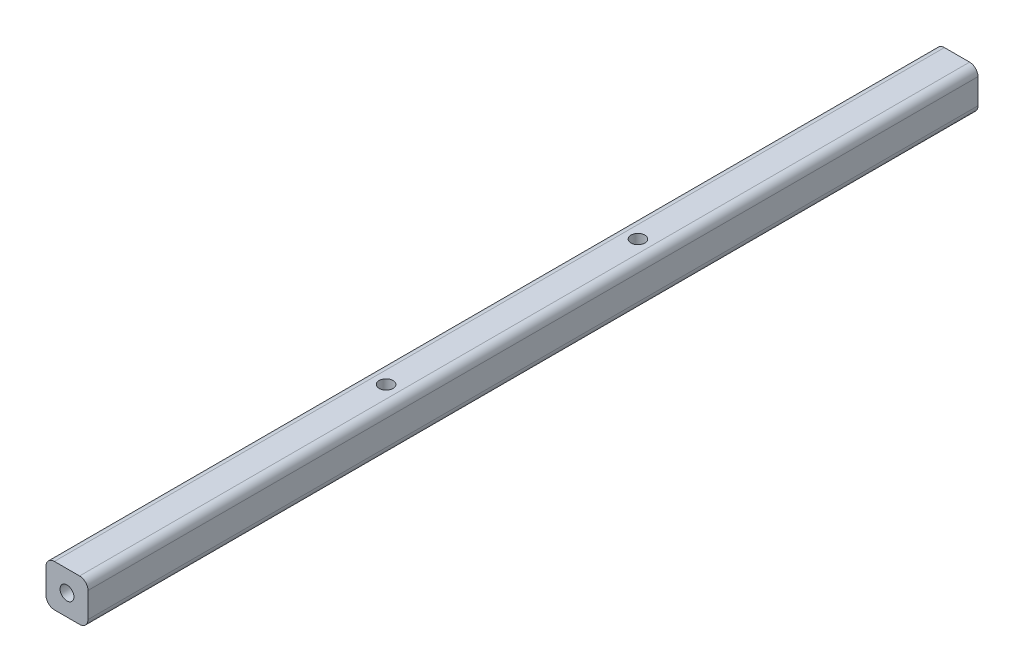
ISO-10303-21;
HEADER;
FILE_DESCRIPTION(('STEP AP214'),'2;1');
FILE_NAME('part.step','',(''),(''),'','','');
FILE_SCHEMA(('AUTOMOTIVE_DESIGN { 1 0 10303 214 1 1 1 1 }'));
ENDSEC;
DATA;
#1=APPLICATION_CONTEXT('core data for automotive mechanical design processes');
#2=APPLICATION_PROTOCOL_DEFINITION('international standard','automotive_design',2000,#1);
#3=PRODUCT_CONTEXT('',#1,'mechanical');
#4=PRODUCT('Part','Part','',(#3));
#5=PRODUCT_RELATED_PRODUCT_CATEGORY('part','',(#4));
#6=PRODUCT_DEFINITION_FORMATION('','',#4);
#7=PRODUCT_DEFINITION_CONTEXT('part definition',#1,'design');
#8=PRODUCT_DEFINITION('design','',#6,#7);
#9=PRODUCT_DEFINITION_SHAPE('','',#8);
#10=(LENGTH_UNIT() NAMED_UNIT(*) SI_UNIT(.MILLI.,.METRE.));
#11=(NAMED_UNIT(*) PLANE_ANGLE_UNIT() SI_UNIT($,.RADIAN.));
#12=(NAMED_UNIT(*) SI_UNIT($,.STERADIAN.) SOLID_ANGLE_UNIT());
#13=UNCERTAINTY_MEASURE_WITH_UNIT(LENGTH_MEASURE(1.E-05),#10,'distance_accuracy_value','');
#14=(GEOMETRIC_REPRESENTATION_CONTEXT(3) GLOBAL_UNCERTAINTY_ASSIGNED_CONTEXT((#13)) GLOBAL_UNIT_ASSIGNED_CONTEXT((#10,
#11,#12)) REPRESENTATION_CONTEXT('',''));
#15=CARTESIAN_POINT('',(0.,0.,0.));
#16=DIRECTION('',(0.,0.,1.));
#17=DIRECTION('',(1.,0.,0.));
#18=AXIS2_PLACEMENT_3D('',#15,#16,#17);
#19=CARTESIAN_POINT('',(-5.,5.,106.));
#20=DIRECTION('',(0.,-1.,0.));
#21=DIRECTION('',(0.,0.,-1.));
#22=AXIS2_PLACEMENT_3D('',#19,#20,#21);
#23=PLANE('',#22);
#24=CARTESIAN_POINT('',(0.,5.,30.));
#25=DIRECTION('',(0.,1.,0.));
#26=DIRECTION('',(0.,0.,1.));
#27=AXIS2_PLACEMENT_3D('',#24,#25,#26);
#28=CIRCLE('',#27,1.64999999999999);
#29=CARTESIAN_POINT('',(0.,5.,31.65));
#30=VERTEX_POINT('',#29);
#31=EDGE_CURVE('E250',#30,#30,#28,.T.);
#32=ORIENTED_EDGE('',*,*,#31,.F.);
#33=EDGE_LOOP('',(#32));
#34=FACE_BOUND('',#33,.T.);
#35=DIRECTION('',(-1.,0.,0.));
#36=VECTOR('',#35,1.);
#37=CARTESIAN_POINT('',(-5.,5.,106.));
#38=LINE('',#37,#36);
#39=CARTESIAN_POINT('',(3.,5.,106.));
#40=VERTEX_POINT('',#39);
#41=CARTESIAN_POINT('',(-3.,5.,106.));
#42=VERTEX_POINT('',#41);
#43=EDGE_CURVE('E139',#40,#42,#38,.T.);
#44=ORIENTED_EDGE('',*,*,#43,.F.);
#45=DIRECTION('',(0.,0.,-1.));
#46=VECTOR('',#45,1.);
#47=CARTESIAN_POINT('',(3.,5.,106.));
#48=LINE('',#47,#46);
#49=CARTESIAN_POINT('',(3.,5.,-106.));
#50=VERTEX_POINT('',#49);
#51=EDGE_CURVE('E153',#40,#50,#48,.T.);
#52=ORIENTED_EDGE('',*,*,#51,.T.);
#53=DIRECTION('',(-1.,0.,0.));
#54=VECTOR('',#53,1.);
#55=CARTESIAN_POINT('',(-5.,5.,-106.));
#56=LINE('',#55,#54);
#57=CARTESIAN_POINT('',(-3.,5.,-106.));
#58=VERTEX_POINT('',#57);
#59=EDGE_CURVE('E134',#50,#58,#56,.T.);
#60=ORIENTED_EDGE('',*,*,#59,.T.);
#61=DIRECTION('',(0.,0.,-1.));
#62=VECTOR('',#61,1.);
#63=CARTESIAN_POINT('',(-3.,5.,106.));
#64=LINE('',#63,#62);
#65=EDGE_CURVE('E142',#58,#42,#64,.F.);
#66=ORIENTED_EDGE('',*,*,#65,.T.);
#67=EDGE_LOOP('',(#44,#52,#60,#66));
#68=FACE_BOUND('',#67,.T.);
#69=CARTESIAN_POINT('',(0.,5.,-30.));
#70=DIRECTION('',(0.,1.,0.));
#71=DIRECTION('',(0.,0.,1.));
#72=AXIS2_PLACEMENT_3D('',#69,#70,#71);
#73=CIRCLE('',#72,1.64999999999999);
#74=CARTESIAN_POINT('',(0.,5.,-28.35));
#75=VERTEX_POINT('',#74);
#76=EDGE_CURVE('E245',#75,#75,#73,.T.);
#77=ORIENTED_EDGE('',*,*,#76,.F.);
#78=EDGE_LOOP('',(#77));
#79=FACE_BOUND('',#78,.T.);
#80=ADVANCED_FACE('F37',(#34,#68,#79),#23,.F.);
#81=CARTESIAN_POINT('',(-5.,5.,106.));
#82=DIRECTION('',(1.,0.,0.));
#83=DIRECTION('',(0.,1.,0.));
#84=AXIS2_PLACEMENT_3D('',#81,#82,#83);
#85=PLANE('',#84);
#86=DIRECTION('',(0.,-1.,0.));
#87=VECTOR('',#86,1.);
#88=CARTESIAN_POINT('',(-5.,5.,106.));
#89=LINE('',#88,#87);
#90=CARTESIAN_POINT('',(-5.,3.,106.));
#91=VERTEX_POINT('',#90);
#92=CARTESIAN_POINT('',(-5.,-3.,106.));
#93=VERTEX_POINT('',#92);
#94=EDGE_CURVE('E131',#91,#93,#89,.T.);
#95=ORIENTED_EDGE('',*,*,#94,.F.);
#96=DIRECTION('',(0.,0.,-1.));
#97=VECTOR('',#96,1.);
#98=CARTESIAN_POINT('',(-5.,3.,106.));
#99=LINE('',#98,#97);
#100=CARTESIAN_POINT('',(-5.,3.,-106.));
#101=VERTEX_POINT('',#100);
#102=EDGE_CURVE('E178',#91,#101,#99,.T.);
#103=ORIENTED_EDGE('',*,*,#102,.T.);
#104=DIRECTION('',(0.,-1.,0.));
#105=VECTOR('',#104,1.);
#106=CARTESIAN_POINT('',(-5.,5.,-106.));
#107=LINE('',#106,#105);
#108=CARTESIAN_POINT('',(-5.,-3.,-106.));
#109=VERTEX_POINT('',#108);
#110=EDGE_CURVE('E130',#101,#109,#107,.T.);
#111=ORIENTED_EDGE('',*,*,#110,.T.);
#112=DIRECTION('',(0.,0.,-1.));
#113=VECTOR('',#112,1.);
#114=CARTESIAN_POINT('',(-5.,-3.,106.));
#115=LINE('',#114,#113);
#116=EDGE_CURVE('E176',#109,#93,#115,.F.);
#117=ORIENTED_EDGE('',*,*,#116,.T.);
#118=EDGE_LOOP('',(#95,#103,#111,#117));
#119=FACE_BOUND('',#118,.T.);
#120=ADVANCED_FACE('F184',(#119),#85,.F.);
#121=CARTESIAN_POINT('',(-5.,-5.,106.));
#122=DIRECTION('',(0.,1.,0.));
#123=DIRECTION('',(0.,0.,1.));
#124=AXIS2_PLACEMENT_3D('',#121,#122,#123);
#125=PLANE('',#124);
#126=CARTESIAN_POINT('',(0.,-5.,30.));
#127=DIRECTION('',(0.,1.,0.));
#128=DIRECTION('',(0.,0.,1.));
#129=AXIS2_PLACEMENT_3D('',#126,#127,#128);
#130=CIRCLE('',#129,1.64999999999999);
#131=CARTESIAN_POINT('',(0.,-5.,31.65));
#132=VERTEX_POINT('',#131);
#133=EDGE_CURVE('E241',#132,#132,#130,.T.);
#134=ORIENTED_EDGE('',*,*,#133,.T.);
#135=EDGE_LOOP('',(#134));
#136=FACE_BOUND('',#135,.T.);
#137=CARTESIAN_POINT('',(0.,-5.,-30.));
#138=DIRECTION('',(0.,1.,0.));
#139=DIRECTION('',(0.,0.,1.));
#140=AXIS2_PLACEMENT_3D('',#137,#138,#139);
#141=CIRCLE('',#140,1.64999999999999);
#142=CARTESIAN_POINT('',(0.,-5.,-28.35));
#143=VERTEX_POINT('',#142);
#144=EDGE_CURVE('E124',#143,#143,#141,.T.);
#145=ORIENTED_EDGE('',*,*,#144,.T.);
#146=EDGE_LOOP('',(#145));
#147=FACE_BOUND('',#146,.T.);
#148=DIRECTION('',(1.,0.,0.));
#149=VECTOR('',#148,1.);
#150=CARTESIAN_POINT('',(-5.,-5.,106.));
#151=LINE('',#150,#149);
#152=CARTESIAN_POINT('',(-3.,-5.,106.));
#153=VERTEX_POINT('',#152);
#154=CARTESIAN_POINT('',(3.,-5.,106.));
#155=VERTEX_POINT('',#154);
#156=EDGE_CURVE('E133',#153,#155,#151,.T.);
#157=ORIENTED_EDGE('',*,*,#156,.F.);
#158=DIRECTION('',(0.,0.,-1.));
#159=VECTOR('',#158,1.);
#160=CARTESIAN_POINT('',(-3.,-5.,106.));
#161=LINE('',#160,#159);
#162=CARTESIAN_POINT('',(-3.,-5.,-106.));
#163=VERTEX_POINT('',#162);
#164=EDGE_CURVE('E11',#153,#163,#161,.T.);
#165=ORIENTED_EDGE('',*,*,#164,.T.);
#166=DIRECTION('',(1.,0.,0.));
#167=VECTOR('',#166,1.);
#168=CARTESIAN_POINT('',(-5.,-5.,-106.));
#169=LINE('',#168,#167);
#170=CARTESIAN_POINT('',(3.,-5.,-106.));
#171=VERTEX_POINT('',#170);
#172=EDGE_CURVE('E145',#163,#171,#169,.T.);
#173=ORIENTED_EDGE('',*,*,#172,.T.);
#174=DIRECTION('',(0.,0.,-1.));
#175=VECTOR('',#174,1.);
#176=CARTESIAN_POINT('',(3.,-5.,106.));
#177=LINE('',#176,#175);
#178=EDGE_CURVE('E45',#171,#155,#177,.F.);
#179=ORIENTED_EDGE('',*,*,#178,.T.);
#180=EDGE_LOOP('',(#157,#165,#173,#179));
#181=FACE_BOUND('',#180,.T.);
#182=ADVANCED_FACE('F195',(#136,#147,#181),#125,.F.);
#183=CARTESIAN_POINT('',(5.,5.,106.));
#184=DIRECTION('',(-1.,0.,0.));
#185=DIRECTION('',(0.,-1.,0.));
#186=AXIS2_PLACEMENT_3D('',#183,#184,#185);
#187=PLANE('',#186);
#188=DIRECTION('',(0.,1.,0.));
#189=VECTOR('',#188,1.);
#190=CARTESIAN_POINT('',(5.,5.,-106.));
#191=LINE('',#190,#189);
#192=CARTESIAN_POINT('',(5.,-3.,-106.));
#193=VERTEX_POINT('',#192);
#194=CARTESIAN_POINT('',(5.,3.,-106.));
#195=VERTEX_POINT('',#194);
#196=EDGE_CURVE('E147',#193,#195,#191,.T.);
#197=ORIENTED_EDGE('',*,*,#196,.T.);
#198=DIRECTION('',(0.,0.,-1.));
#199=VECTOR('',#198,1.);
#200=CARTESIAN_POINT('',(5.,3.,106.));
#201=LINE('',#200,#199);
#202=CARTESIAN_POINT('',(5.,3.,106.));
#203=VERTEX_POINT('',#202);
#204=EDGE_CURVE('E167',#195,#203,#201,.F.);
#205=ORIENTED_EDGE('',*,*,#204,.T.);
#206=DIRECTION('',(0.,1.,0.));
#207=VECTOR('',#206,1.);
#208=CARTESIAN_POINT('',(5.,5.,106.));
#209=LINE('',#208,#207);
#210=CARTESIAN_POINT('',(5.,-3.,106.));
#211=VERTEX_POINT('',#210);
#212=EDGE_CURVE('E136',#211,#203,#209,.T.);
#213=ORIENTED_EDGE('',*,*,#212,.F.);
#214=DIRECTION('',(0.,0.,-1.));
#215=VECTOR('',#214,1.);
#216=CARTESIAN_POINT('',(5.,-3.,106.));
#217=LINE('',#216,#215);
#218=EDGE_CURVE('E164',#211,#193,#217,.T.);
#219=ORIENTED_EDGE('',*,*,#218,.T.);
#220=EDGE_LOOP('',(#197,#205,#213,#219));
#221=FACE_BOUND('',#220,.T.);
#222=ADVANCED_FACE('F203',(#221),#187,.F.);
#223=CARTESIAN_POINT('',(0.,0.,106.));
#224=DIRECTION('',(0.,0.,1.));
#225=DIRECTION('',(1.,0.,0.));
#226=AXIS2_PLACEMENT_3D('',#223,#224,#225);
#227=PLANE('',#226);
#228=CARTESIAN_POINT('',(0.,0.,106.));
#229=DIRECTION('',(0.,0.,1.));
#230=DIRECTION('',(1.,0.,0.));
#231=AXIS2_PLACEMENT_3D('',#228,#229,#230);
#232=CIRCLE('',#231,1.64999999999999);
#233=CARTESIAN_POINT('',(1.64999999999999,0.,106.));
#234=VERTEX_POINT('',#233);
#235=EDGE_CURVE('E117',#234,#234,#232,.T.);
#236=ORIENTED_EDGE('',*,*,#235,.F.);
#237=EDGE_LOOP('',(#236));
#238=FACE_BOUND('',#237,.T.);
#239=ORIENTED_EDGE('',*,*,#212,.T.);
#240=CARTESIAN_POINT('',(3.,3.,106.));
#241=DIRECTION('',(0.,0.,1.));
#242=DIRECTION('',(1.,0.,0.));
#243=AXIS2_PLACEMENT_3D('',#240,#241,#242);
#244=CIRCLE('',#243,2.);
#245=EDGE_CURVE('E174',#203,#40,#244,.T.);
#246=ORIENTED_EDGE('',*,*,#245,.T.);
#247=ORIENTED_EDGE('',*,*,#43,.T.);
#248=CARTESIAN_POINT('',(-3.,3.,106.));
#249=DIRECTION('',(0.,0.,1.));
#250=DIRECTION('',(1.,0.,0.));
#251=AXIS2_PLACEMENT_3D('',#248,#249,#250);
#252=CIRCLE('',#251,2.);
#253=EDGE_CURVE('E172',#42,#91,#252,.T.);
#254=ORIENTED_EDGE('',*,*,#253,.T.);
#255=ORIENTED_EDGE('',*,*,#94,.T.);
#256=CARTESIAN_POINT('',(-3.,-3.,106.));
#257=DIRECTION('',(0.,0.,1.));
#258=DIRECTION('',(1.,0.,0.));
#259=AXIS2_PLACEMENT_3D('',#256,#257,#258);
#260=CIRCLE('',#259,2.);
#261=EDGE_CURVE('E58',#93,#153,#260,.T.);
#262=ORIENTED_EDGE('',*,*,#261,.T.);
#263=ORIENTED_EDGE('',*,*,#156,.T.);
#264=CARTESIAN_POINT('',(3.,-3.,106.));
#265=DIRECTION('',(0.,0.,1.));
#266=DIRECTION('',(1.,0.,0.));
#267=AXIS2_PLACEMENT_3D('',#264,#265,#266);
#268=CIRCLE('',#267,2.);
#269=EDGE_CURVE('E169',#155,#211,#268,.T.);
#270=ORIENTED_EDGE('',*,*,#269,.T.);
#271=EDGE_LOOP('',(#239,#246,#247,#254,#255,#262,#263,#270));
#272=FACE_BOUND('',#271,.T.);
#273=ADVANCED_FACE('F197',(#238,#272),#227,.T.);
#274=CARTESIAN_POINT('',(0.,0.,-106.));
#275=DIRECTION('',(0.,0.,1.));
#276=DIRECTION('',(1.,0.,0.));
#277=AXIS2_PLACEMENT_3D('',#274,#275,#276);
#278=PLANE('',#277);
#279=CARTESIAN_POINT('',(0.,0.,-106.));
#280=DIRECTION('',(0.,0.,-1.));
#281=DIRECTION('',(-1.,0.,0.));
#282=AXIS2_PLACEMENT_3D('',#279,#280,#281);
#283=CIRCLE('',#282,1.64999999999999);
#284=CARTESIAN_POINT('',(-1.64999999999999,0.,-106.));
#285=VERTEX_POINT('',#284);
#286=EDGE_CURVE('E118',#285,#285,#283,.T.);
#287=ORIENTED_EDGE('',*,*,#286,.F.);
#288=EDGE_LOOP('',(#287));
#289=FACE_BOUND('',#288,.T.);
#290=ORIENTED_EDGE('',*,*,#59,.F.);
#291=CARTESIAN_POINT('',(3.,3.,-106.));
#292=DIRECTION('',(0.,0.,1.));
#293=DIRECTION('',(1.,0.,0.));
#294=AXIS2_PLACEMENT_3D('',#291,#292,#293);
#295=CIRCLE('',#294,2.);
#296=EDGE_CURVE('E162',#50,#195,#295,.F.);
#297=ORIENTED_EDGE('',*,*,#296,.T.);
#298=ORIENTED_EDGE('',*,*,#196,.F.);
#299=CARTESIAN_POINT('',(3.,-3.,-106.));
#300=DIRECTION('',(0.,0.,1.));
#301=DIRECTION('',(1.,0.,0.));
#302=AXIS2_PLACEMENT_3D('',#299,#300,#301);
#303=CIRCLE('',#302,2.);
#304=EDGE_CURVE('E156',#193,#171,#303,.F.);
#305=ORIENTED_EDGE('',*,*,#304,.T.);
#306=ORIENTED_EDGE('',*,*,#172,.F.);
#307=CARTESIAN_POINT('',(-3.,-3.,-106.));
#308=DIRECTION('',(0.,0.,1.));
#309=DIRECTION('',(1.,0.,0.));
#310=AXIS2_PLACEMENT_3D('',#307,#308,#309);
#311=CIRCLE('',#310,2.);
#312=EDGE_CURVE('E158',#163,#109,#311,.F.);
#313=ORIENTED_EDGE('',*,*,#312,.T.);
#314=ORIENTED_EDGE('',*,*,#110,.F.);
#315=CARTESIAN_POINT('',(-3.,3.,-106.));
#316=DIRECTION('',(0.,0.,1.));
#317=DIRECTION('',(1.,0.,0.));
#318=AXIS2_PLACEMENT_3D('',#315,#316,#317);
#319=CIRCLE('',#318,2.);
#320=EDGE_CURVE('E160',#101,#58,#319,.F.);
#321=ORIENTED_EDGE('',*,*,#320,.T.);
#322=EDGE_LOOP('',(#290,#297,#298,#305,#306,#313,#314,#321));
#323=FACE_BOUND('',#322,.T.);
#324=ADVANCED_FACE('F190',(#289,#323),#278,.F.);
#325=CARTESIAN_POINT('',(0.,0.,94.5));
#326=DIRECTION('',(0.,0.,1.));
#327=DIRECTION('',(1.,0.,0.));
#328=AXIS2_PLACEMENT_3D('',#325,#326,#327);
#329=CONICAL_SURFACE('',#328,1.65,1.02974425867665);
#330=CARTESIAN_POINT('',(0.,0.,93.5085799786045));
#331=VERTEX_POINT('',#330);
#332=VERTEX_LOOP('',#331);
#333=FACE_BOUND('',#332,.T.);
#334=CARTESIAN_POINT('',(0.,0.,94.5));
#335=DIRECTION('',(0.,0.,1.));
#336=DIRECTION('',(1.,0.,0.));
#337=AXIS2_PLACEMENT_3D('',#334,#335,#336);
#338=CIRCLE('',#337,1.65);
#339=CARTESIAN_POINT('',(1.65,0.,94.5));
#340=VERTEX_POINT('',#339);
#341=EDGE_CURVE('E121',#340,#340,#338,.T.);
#342=ORIENTED_EDGE('',*,*,#341,.T.);
#343=EDGE_LOOP('',(#342));
#344=FACE_BOUND('',#343,.T.);
#345=ADVANCED_FACE('F267',(#333,#344),#329,.F.);
#346=CARTESIAN_POINT('',(0.,0.,106.));
#347=DIRECTION('',(0.,0.,1.));
#348=DIRECTION('',(1.,0.,0.));
#349=AXIS2_PLACEMENT_3D('',#346,#347,#348);
#350=CYLINDRICAL_SURFACE('',#349,1.64999999999999);
#351=ORIENTED_EDGE('',*,*,#341,.F.);
#352=EDGE_LOOP('',(#351));
#353=FACE_BOUND('',#352,.T.);
#354=ORIENTED_EDGE('',*,*,#235,.T.);
#355=EDGE_LOOP('',(#354));
#356=FACE_BOUND('',#355,.T.);
#357=ADVANCED_FACE('F111',(#353,#356),#350,.F.);
#358=CARTESIAN_POINT('',(0.,0.,-94.5));
#359=DIRECTION('',(0.,0.,-1.));
#360=DIRECTION('',(-1.,0.,0.));
#361=AXIS2_PLACEMENT_3D('',#358,#359,#360);
#362=CONICAL_SURFACE('',#361,1.65,1.02974425867665);
#363=CARTESIAN_POINT('',(0.,0.,-93.5085799786045));
#364=VERTEX_POINT('',#363);
#365=VERTEX_LOOP('',#364);
#366=FACE_BOUND('',#365,.T.);
#367=CARTESIAN_POINT('',(0.,0.,-94.5));
#368=DIRECTION('',(0.,0.,-1.));
#369=DIRECTION('',(-1.,0.,0.));
#370=AXIS2_PLACEMENT_3D('',#367,#368,#369);
#371=CIRCLE('',#370,1.65);
#372=CARTESIAN_POINT('',(-1.65,0.,-94.5));
#373=VERTEX_POINT('',#372);
#374=EDGE_CURVE('E115',#373,#373,#371,.T.);
#375=ORIENTED_EDGE('',*,*,#374,.T.);
#376=EDGE_LOOP('',(#375));
#377=FACE_BOUND('',#376,.T.);
#378=ADVANCED_FACE('F107',(#366,#377),#362,.F.);
#379=CARTESIAN_POINT('',(0.,0.,-106.));
#380=DIRECTION('',(0.,0.,-1.));
#381=DIRECTION('',(-1.,0.,0.));
#382=AXIS2_PLACEMENT_3D('',#379,#380,#381);
#383=CYLINDRICAL_SURFACE('',#382,1.64999999999999);
#384=ORIENTED_EDGE('',*,*,#374,.F.);
#385=EDGE_LOOP('',(#384));
#386=FACE_BOUND('',#385,.T.);
#387=ORIENTED_EDGE('',*,*,#286,.T.);
#388=EDGE_LOOP('',(#387));
#389=FACE_BOUND('',#388,.T.);
#390=ADVANCED_FACE('F110',(#386,#389),#383,.F.);
#391=CARTESIAN_POINT('',(3.,3.,106.));
#392=DIRECTION('',(0.,0.,-1.));
#393=DIRECTION('',(-1.,0.,0.));
#394=AXIS2_PLACEMENT_3D('',#391,#392,#393);
#395=CYLINDRICAL_SURFACE('',#394,2.);
#396=ORIENTED_EDGE('',*,*,#245,.F.);
#397=ORIENTED_EDGE('',*,*,#204,.F.);
#398=ORIENTED_EDGE('',*,*,#296,.F.);
#399=ORIENTED_EDGE('',*,*,#51,.F.);
#400=EDGE_LOOP('',(#396,#397,#398,#399));
#401=FACE_BOUND('',#400,.T.);
#402=ADVANCED_FACE('F208',(#401),#395,.T.);
#403=CARTESIAN_POINT('',(-3.,3.,106.));
#404=DIRECTION('',(0.,0.,-1.));
#405=DIRECTION('',(-1.,0.,0.));
#406=AXIS2_PLACEMENT_3D('',#403,#404,#405);
#407=CYLINDRICAL_SURFACE('',#406,2.);
#408=ORIENTED_EDGE('',*,*,#253,.F.);
#409=ORIENTED_EDGE('',*,*,#65,.F.);
#410=ORIENTED_EDGE('',*,*,#320,.F.);
#411=ORIENTED_EDGE('',*,*,#102,.F.);
#412=EDGE_LOOP('',(#408,#409,#410,#411));
#413=FACE_BOUND('',#412,.T.);
#414=ADVANCED_FACE('F213',(#413),#407,.T.);
#415=CARTESIAN_POINT('',(-3.,-3.,106.));
#416=DIRECTION('',(0.,0.,-1.));
#417=DIRECTION('',(-1.,0.,0.));
#418=AXIS2_PLACEMENT_3D('',#415,#416,#417);
#419=CYLINDRICAL_SURFACE('',#418,2.);
#420=ORIENTED_EDGE('',*,*,#261,.F.);
#421=ORIENTED_EDGE('',*,*,#116,.F.);
#422=ORIENTED_EDGE('',*,*,#312,.F.);
#423=ORIENTED_EDGE('',*,*,#164,.F.);
#424=EDGE_LOOP('',(#420,#421,#422,#423));
#425=FACE_BOUND('',#424,.T.);
#426=ADVANCED_FACE('F194',(#425),#419,.T.);
#427=CARTESIAN_POINT('',(3.,-3.,106.));
#428=DIRECTION('',(0.,0.,-1.));
#429=DIRECTION('',(-1.,0.,0.));
#430=AXIS2_PLACEMENT_3D('',#427,#428,#429);
#431=CYLINDRICAL_SURFACE('',#430,2.);
#432=ORIENTED_EDGE('',*,*,#269,.F.);
#433=ORIENTED_EDGE('',*,*,#178,.F.);
#434=ORIENTED_EDGE('',*,*,#304,.F.);
#435=ORIENTED_EDGE('',*,*,#218,.F.);
#436=EDGE_LOOP('',(#432,#433,#434,#435));
#437=FACE_BOUND('',#436,.T.);
#438=ADVANCED_FACE('F39',(#437),#431,.T.);
#439=CARTESIAN_POINT('',(0.,5.,-30.));
#440=DIRECTION('',(0.,1.,0.));
#441=DIRECTION('',(0.,0.,1.));
#442=AXIS2_PLACEMENT_3D('',#439,#440,#441);
#443=CYLINDRICAL_SURFACE('',#442,1.64999999999999);
#444=ORIENTED_EDGE('',*,*,#144,.F.);
#445=EDGE_LOOP('',(#444));
#446=FACE_BOUND('',#445,.T.);
#447=ORIENTED_EDGE('',*,*,#76,.T.);
#448=EDGE_LOOP('',(#447));
#449=FACE_BOUND('',#448,.T.);
#450=ADVANCED_FACE('F255',(#446,#449),#443,.F.);
#451=CARTESIAN_POINT('',(0.,5.,30.));
#452=DIRECTION('',(0.,1.,0.));
#453=DIRECTION('',(0.,0.,1.));
#454=AXIS2_PLACEMENT_3D('',#451,#452,#453);
#455=CYLINDRICAL_SURFACE('',#454,1.64999999999999);
#456=ORIENTED_EDGE('',*,*,#133,.F.);
#457=EDGE_LOOP('',(#456));
#458=FACE_BOUND('',#457,.T.);
#459=ORIENTED_EDGE('',*,*,#31,.T.);
#460=EDGE_LOOP('',(#459));
#461=FACE_BOUND('',#460,.T.);
#462=ADVANCED_FACE('F253',(#458,#461),#455,.F.);
#463=CLOSED_SHELL('',(#80,#120,#182,#222,#273,#324,#345,#357,#378,#390,#402,#414,#426,#438,#450,#462));
#464=MANIFOLD_SOLID_BREP('B2',#463);
#465=ADVANCED_BREP_SHAPE_REPRESENTATION('',(#18,#464),#14);
#466=SHAPE_DEFINITION_REPRESENTATION(#9,#465);
ENDSEC;
END-ISO-10303-21;
